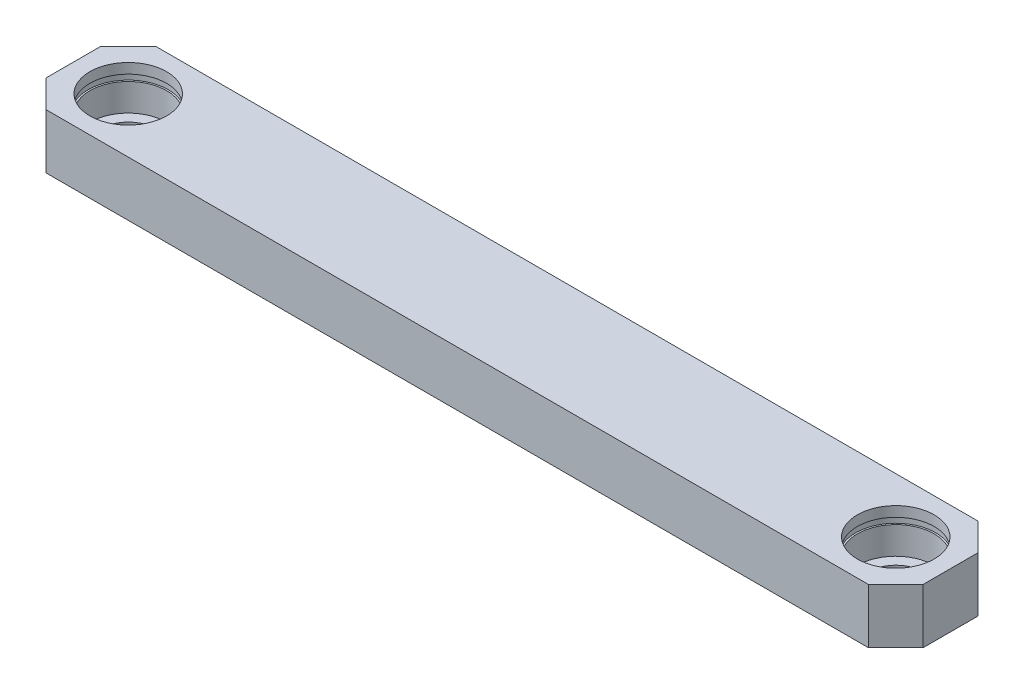
ISO-10303-21;
HEADER;
FILE_DESCRIPTION(('STEP AP214'),'2;1');
FILE_NAME('part.step','',(''),(''),'','','');
FILE_SCHEMA(('AUTOMOTIVE_DESIGN { 1 0 10303 214 1 1 1 1 }'));
ENDSEC;
DATA;
#1=APPLICATION_CONTEXT('core data for automotive mechanical design processes');
#2=APPLICATION_PROTOCOL_DEFINITION('international standard','automotive_design',2000,#1);
#3=PRODUCT_CONTEXT('',#1,'mechanical');
#4=PRODUCT('Part','Part','',(#3));
#5=PRODUCT_RELATED_PRODUCT_CATEGORY('part','',(#4));
#6=PRODUCT_DEFINITION_FORMATION('','',#4);
#7=PRODUCT_DEFINITION_CONTEXT('part definition',#1,'design');
#8=PRODUCT_DEFINITION('design','',#6,#7);
#9=PRODUCT_DEFINITION_SHAPE('','',#8);
#10=(LENGTH_UNIT() NAMED_UNIT(*) SI_UNIT(.MILLI.,.METRE.));
#11=(NAMED_UNIT(*) PLANE_ANGLE_UNIT() SI_UNIT($,.RADIAN.));
#12=(NAMED_UNIT(*) SI_UNIT($,.STERADIAN.) SOLID_ANGLE_UNIT());
#13=UNCERTAINTY_MEASURE_WITH_UNIT(LENGTH_MEASURE(1.E-05),#10,'distance_accuracy_value','');
#14=(GEOMETRIC_REPRESENTATION_CONTEXT(3) GLOBAL_UNCERTAINTY_ASSIGNED_CONTEXT((#13)) GLOBAL_UNIT_ASSIGNED_CONTEXT((#10,
#11,#12)) REPRESENTATION_CONTEXT('',''));
#15=CARTESIAN_POINT('',(0.,0.,0.));
#16=DIRECTION('',(0.,0.,1.));
#17=DIRECTION('',(1.,0.,0.));
#18=AXIS2_PLACEMENT_3D('',#15,#16,#17);
#19=CARTESIAN_POINT('',(0.,10.,-10.));
#20=DIRECTION('',(1.,0.,0.));
#21=DIRECTION('',(0.,0.,-1.));
#22=AXIS2_PLACEMENT_3D('',#19,#20,#21);
#23=PLANE('',#22);
#24=DIRECTION('',(0.,0.,1.));
#25=VECTOR('',#24,1.);
#26=CARTESIAN_POINT('',(0.,10.,-10.));
#27=LINE('',#26,#25);
#28=CARTESIAN_POINT('',(0.,10.,-4.99999999999998));
#29=VERTEX_POINT('',#28);
#30=CARTESIAN_POINT('',(0.,10.,4.99999999999997));
#31=VERTEX_POINT('',#30);
#32=EDGE_CURVE('E118',#29,#31,#27,.T.);
#33=ORIENTED_EDGE('',*,*,#32,.F.);
#34=DIRECTION('',(0.,-1.,0.));
#35=VECTOR('',#34,1.);
#36=CARTESIAN_POINT('',(0.,10.,-4.99999999999998));
#37=LINE('',#36,#35);
#38=CARTESIAN_POINT('',(0.,0.,-4.99999999999998));
#39=VERTEX_POINT('',#38);
#40=EDGE_CURVE('E103',#29,#39,#37,.T.);
#41=ORIENTED_EDGE('',*,*,#40,.T.);
#42=DIRECTION('',(0.,0.,1.));
#43=VECTOR('',#42,1.);
#44=CARTESIAN_POINT('',(0.,0.,-10.));
#45=LINE('',#44,#43);
#46=CARTESIAN_POINT('',(0.,0.,4.99999999999997));
#47=VERTEX_POINT('',#46);
#48=EDGE_CURVE('E115',#39,#47,#45,.T.);
#49=ORIENTED_EDGE('',*,*,#48,.T.);
#50=DIRECTION('',(0.,1.,0.));
#51=VECTOR('',#50,1.);
#52=CARTESIAN_POINT('',(0.,10.,4.99999999999997));
#53=LINE('',#52,#51);
#54=EDGE_CURVE('E120',#47,#31,#53,.T.);
#55=ORIENTED_EDGE('',*,*,#54,.T.);
#56=EDGE_LOOP('',(#33,#41,#49,#55));
#57=FACE_BOUND('',#56,.T.);
#58=ADVANCED_FACE('F33',(#57),#23,.F.);
#59=CARTESIAN_POINT('',(0.,10.,10.));
#60=DIRECTION('',(0.,0.,-1.));
#61=DIRECTION('',(-1.,0.,0.));
#62=AXIS2_PLACEMENT_3D('',#59,#60,#61);
#63=PLANE('',#62);
#64=DIRECTION('',(1.,0.,0.));
#65=VECTOR('',#64,1.);
#66=CARTESIAN_POINT('',(0.,0.,10.));
#67=LINE('',#66,#65);
#68=CARTESIAN_POINT('',(5.00000000000002,0.,10.));
#69=VERTEX_POINT('',#68);
#70=CARTESIAN_POINT('',(155.,0.,10.));
#71=VERTEX_POINT('',#70);
#72=EDGE_CURVE('E124',#69,#71,#67,.T.);
#73=ORIENTED_EDGE('',*,*,#72,.T.);
#74=DIRECTION('',(0.,1.,0.));
#75=VECTOR('',#74,1.);
#76=CARTESIAN_POINT('',(155.,10.,10.));
#77=LINE('',#76,#75);
#78=CARTESIAN_POINT('',(155.,10.,10.));
#79=VERTEX_POINT('',#78);
#80=EDGE_CURVE('E11',#71,#79,#77,.T.);
#81=ORIENTED_EDGE('',*,*,#80,.T.);
#82=DIRECTION('',(1.,0.,0.));
#83=VECTOR('',#82,1.);
#84=CARTESIAN_POINT('',(0.,10.,10.));
#85=LINE('',#84,#83);
#86=CARTESIAN_POINT('',(5.00000000000002,10.,10.));
#87=VERTEX_POINT('',#86);
#88=EDGE_CURVE('E164',#87,#79,#85,.T.);
#89=ORIENTED_EDGE('',*,*,#88,.F.);
#90=DIRECTION('',(0.,-1.,0.));
#91=VECTOR('',#90,1.);
#92=CARTESIAN_POINT('',(5.00000000000002,10.,10.));
#93=LINE('',#92,#91);
#94=EDGE_CURVE('E41',#87,#69,#93,.T.);
#95=ORIENTED_EDGE('',*,*,#94,.T.);
#96=EDGE_LOOP('',(#73,#81,#89,#95));
#97=FACE_BOUND('',#96,.T.);
#98=ADVANCED_FACE('F162',(#97),#63,.F.);
#99=CARTESIAN_POINT('',(160.,10.,-10.));
#100=DIRECTION('',(-1.,0.,0.));
#101=DIRECTION('',(0.,0.,1.));
#102=AXIS2_PLACEMENT_3D('',#99,#100,#101);
#103=PLANE('',#102);
#104=DIRECTION('',(0.,0.,-1.));
#105=VECTOR('',#104,1.);
#106=CARTESIAN_POINT('',(160.,0.,-10.));
#107=LINE('',#106,#105);
#108=CARTESIAN_POINT('',(160.,0.,4.99999999999998));
#109=VERTEX_POINT('',#108);
#110=CARTESIAN_POINT('',(160.,0.,-4.99999999999998));
#111=VERTEX_POINT('',#110);
#112=EDGE_CURVE('E128',#109,#111,#107,.T.);
#113=ORIENTED_EDGE('',*,*,#112,.T.);
#114=DIRECTION('',(0.,1.,0.));
#115=VECTOR('',#114,1.);
#116=CARTESIAN_POINT('',(160.,10.,-4.99999999999998));
#117=LINE('',#116,#115);
#118=CARTESIAN_POINT('',(160.,10.,-4.99999999999998));
#119=VERTEX_POINT('',#118);
#120=EDGE_CURVE('E48',#111,#119,#117,.T.);
#121=ORIENTED_EDGE('',*,*,#120,.T.);
#122=DIRECTION('',(0.,0.,-1.));
#123=VECTOR('',#122,1.);
#124=CARTESIAN_POINT('',(160.,10.,-10.));
#125=LINE('',#124,#123);
#126=CARTESIAN_POINT('',(160.,10.,4.99999999999998));
#127=VERTEX_POINT('',#126);
#128=EDGE_CURVE('E172',#127,#119,#125,.T.);
#129=ORIENTED_EDGE('',*,*,#128,.F.);
#130=DIRECTION('',(0.,-1.,0.));
#131=VECTOR('',#130,1.);
#132=CARTESIAN_POINT('',(160.,10.,4.99999999999998));
#133=LINE('',#132,#131);
#134=EDGE_CURVE('E155',#127,#109,#133,.T.);
#135=ORIENTED_EDGE('',*,*,#134,.T.);
#136=EDGE_LOOP('',(#113,#121,#129,#135));
#137=FACE_BOUND('',#136,.T.);
#138=ADVANCED_FACE('F171',(#137),#103,.F.);
#139=CARTESIAN_POINT('',(0.,10.,-10.));
#140=DIRECTION('',(0.,0.,1.));
#141=DIRECTION('',(1.,0.,0.));
#142=AXIS2_PLACEMENT_3D('',#139,#140,#141);
#143=PLANE('',#142);
#144=DIRECTION('',(-1.,0.,0.));
#145=VECTOR('',#144,1.);
#146=CARTESIAN_POINT('',(0.,0.,-10.));
#147=LINE('',#146,#145);
#148=CARTESIAN_POINT('',(155.,0.,-10.));
#149=VERTEX_POINT('',#148);
#150=CARTESIAN_POINT('',(5.00000000000004,0.,-10.));
#151=VERTEX_POINT('',#150);
#152=EDGE_CURVE('E138',#149,#151,#147,.T.);
#153=ORIENTED_EDGE('',*,*,#152,.T.);
#154=DIRECTION('',(0.,1.,0.));
#155=VECTOR('',#154,1.);
#156=CARTESIAN_POINT('',(5.00000000000004,10.,-10.));
#157=LINE('',#156,#155);
#158=CARTESIAN_POINT('',(5.00000000000004,10.,-10.));
#159=VERTEX_POINT('',#158);
#160=EDGE_CURVE('E104',#151,#159,#157,.T.);
#161=ORIENTED_EDGE('',*,*,#160,.T.);
#162=DIRECTION('',(-1.,0.,0.));
#163=VECTOR('',#162,1.);
#164=CARTESIAN_POINT('',(0.,10.,-10.));
#165=LINE('',#164,#163);
#166=CARTESIAN_POINT('',(155.,10.,-10.));
#167=VERTEX_POINT('',#166);
#168=EDGE_CURVE('E134',#167,#159,#165,.T.);
#169=ORIENTED_EDGE('',*,*,#168,.F.);
#170=DIRECTION('',(0.,-1.,0.));
#171=VECTOR('',#170,1.);
#172=CARTESIAN_POINT('',(155.,10.,-10.));
#173=LINE('',#172,#171);
#174=EDGE_CURVE('E109',#167,#149,#173,.T.);
#175=ORIENTED_EDGE('',*,*,#174,.T.);
#176=EDGE_LOOP('',(#153,#161,#169,#175));
#177=FACE_BOUND('',#176,.T.);
#178=ADVANCED_FACE('F228',(#177),#143,.F.);
#179=CARTESIAN_POINT('',(0.,10.,0.));
#180=DIRECTION('',(0.,1.,0.));
#181=DIRECTION('',(0.,0.,1.));
#182=AXIS2_PLACEMENT_3D('',#179,#180,#181);
#183=PLANE('',#182);
#184=CARTESIAN_POINT('',(150.,10.,0.));
#185=DIRECTION('',(0.,1.,0.));
#186=DIRECTION('',(0.,0.,1.));
#187=AXIS2_PLACEMENT_3D('',#184,#185,#186);
#188=CIRCLE('',#187,7.00000000000001);
#189=CARTESIAN_POINT('',(150.,10.,7.00000000000001));
#190=VERTEX_POINT('',#189);
#191=EDGE_CURVE('E219',#190,#190,#188,.T.);
#192=ORIENTED_EDGE('',*,*,#191,.F.);
#193=EDGE_LOOP('',(#192));
#194=FACE_BOUND('',#193,.T.);
#195=CARTESIAN_POINT('',(10.,10.,0.));
#196=DIRECTION('',(0.,1.,0.));
#197=DIRECTION('',(-1.,0.,0.));
#198=AXIS2_PLACEMENT_3D('',#195,#196,#197);
#199=CIRCLE('',#198,7.);
#200=CARTESIAN_POINT('',(3.,10.,0.));
#201=VERTEX_POINT('',#200);
#202=EDGE_CURVE('E192',#201,#201,#199,.T.);
#203=ORIENTED_EDGE('',*,*,#202,.F.);
#204=EDGE_LOOP('',(#203));
#205=FACE_BOUND('',#204,.T.);
#206=ORIENTED_EDGE('',*,*,#168,.T.);
#207=DIRECTION('',(0.707106781186549,0.,-0.707106781186547));
#208=VECTOR('',#207,1.);
#209=CARTESIAN_POINT('',(-2.49999999999999,10.,-2.5));
#210=LINE('',#209,#208);
#211=EDGE_CURVE('E153',#159,#29,#210,.F.);
#212=ORIENTED_EDGE('',*,*,#211,.T.);
#213=ORIENTED_EDGE('',*,*,#32,.T.);
#214=DIRECTION('',(-0.707106781186547,0.,-0.707106781186549));
#215=VECTOR('',#214,1.);
#216=CARTESIAN_POINT('',(-2.49999999999998,10.,2.49999999999998));
#217=LINE('',#216,#215);
#218=EDGE_CURVE('E148',#31,#87,#217,.F.);
#219=ORIENTED_EDGE('',*,*,#218,.T.);
#220=ORIENTED_EDGE('',*,*,#88,.T.);
#221=DIRECTION('',(-0.707106781186549,0.,0.707106781186547));
#222=VECTOR('',#221,1.);
#223=CARTESIAN_POINT('',(82.4999999999998,10.,82.5));
#224=LINE('',#223,#222);
#225=EDGE_CURVE('E55',#79,#127,#224,.F.);
#226=ORIENTED_EDGE('',*,*,#225,.T.);
#227=ORIENTED_EDGE('',*,*,#128,.T.);
#228=DIRECTION('',(0.707106781186547,0.,0.707106781186549));
#229=VECTOR('',#228,1.);
#230=CARTESIAN_POINT('',(82.5000000000002,10.,-82.5));
#231=LINE('',#230,#229);
#232=EDGE_CURVE('E151',#119,#167,#231,.F.);
#233=ORIENTED_EDGE('',*,*,#232,.T.);
#234=EDGE_LOOP('',(#206,#212,#213,#219,#220,#226,#227,#233));
#235=FACE_BOUND('',#234,.T.);
#236=ADVANCED_FACE('F225',(#194,#205,#235),#183,.T.);
#237=CARTESIAN_POINT('',(0.,0.,0.));
#238=DIRECTION('',(0.,1.,0.));
#239=DIRECTION('',(0.,0.,1.));
#240=AXIS2_PLACEMENT_3D('',#237,#238,#239);
#241=PLANE('',#240);
#242=CARTESIAN_POINT('',(150.,0.,0.));
#243=DIRECTION('',(0.,1.,0.));
#244=DIRECTION('',(0.,0.,1.));
#245=AXIS2_PLACEMENT_3D('',#242,#243,#244);
#246=CIRCLE('',#245,5.);
#247=CARTESIAN_POINT('',(150.,0.,5.));
#248=VERTEX_POINT('',#247);
#249=EDGE_CURVE('E198',#248,#248,#246,.T.);
#250=ORIENTED_EDGE('',*,*,#249,.T.);
#251=EDGE_LOOP('',(#250));
#252=FACE_BOUND('',#251,.T.);
#253=CARTESIAN_POINT('',(10.,0.,0.));
#254=DIRECTION('',(0.,1.,0.));
#255=DIRECTION('',(-1.,0.,0.));
#256=AXIS2_PLACEMENT_3D('',#253,#254,#255);
#257=CIRCLE('',#256,5.);
#258=CARTESIAN_POINT('',(5.,0.,0.));
#259=VERTEX_POINT('',#258);
#260=EDGE_CURVE('E189',#259,#259,#257,.T.);
#261=ORIENTED_EDGE('',*,*,#260,.T.);
#262=EDGE_LOOP('',(#261));
#263=FACE_BOUND('',#262,.T.);
#264=ORIENTED_EDGE('',*,*,#48,.F.);
#265=DIRECTION('',(-0.707106781186549,0.,0.707106781186547));
#266=VECTOR('',#265,1.);
#267=CARTESIAN_POINT('',(0.,0.,-4.99999999999998));
#268=LINE('',#267,#266);
#269=EDGE_CURVE('E99',#39,#151,#268,.F.);
#270=ORIENTED_EDGE('',*,*,#269,.T.);
#271=ORIENTED_EDGE('',*,*,#152,.F.);
#272=DIRECTION('',(-0.707106781186547,0.,-0.707106781186549));
#273=VECTOR('',#272,1.);
#274=CARTESIAN_POINT('',(155.,0.,-10.));
#275=LINE('',#274,#273);
#276=EDGE_CURVE('E110',#149,#111,#275,.F.);
#277=ORIENTED_EDGE('',*,*,#276,.T.);
#278=ORIENTED_EDGE('',*,*,#112,.F.);
#279=DIRECTION('',(0.707106781186549,0.,-0.707106781186547));
#280=VECTOR('',#279,1.);
#281=CARTESIAN_POINT('',(160.,0.,4.99999999999998));
#282=LINE('',#281,#280);
#283=EDGE_CURVE('E142',#109,#71,#282,.F.);
#284=ORIENTED_EDGE('',*,*,#283,.T.);
#285=ORIENTED_EDGE('',*,*,#72,.F.);
#286=DIRECTION('',(0.707106781186547,0.,0.707106781186549));
#287=VECTOR('',#286,1.);
#288=CARTESIAN_POINT('',(5.00000000000002,0.,10.));
#289=LINE('',#288,#287);
#290=EDGE_CURVE('E119',#69,#47,#289,.F.);
#291=ORIENTED_EDGE('',*,*,#290,.T.);
#292=EDGE_LOOP('',(#264,#270,#271,#277,#278,#284,#285,#291));
#293=FACE_BOUND('',#292,.T.);
#294=ADVANCED_FACE('F122',(#252,#263,#293),#241,.F.);
#295=CARTESIAN_POINT('',(0.,10.,-4.99999999999998));
#296=DIRECTION('',(0.707106781186546,0.,0.707106781186548));
#297=DIRECTION('',(0.,-1.,0.));
#298=AXIS2_PLACEMENT_3D('',#295,#296,#297);
#299=PLANE('',#298);
#300=ORIENTED_EDGE('',*,*,#211,.F.);
#301=ORIENTED_EDGE('',*,*,#160,.F.);
#302=ORIENTED_EDGE('',*,*,#269,.F.);
#303=ORIENTED_EDGE('',*,*,#40,.F.);
#304=EDGE_LOOP('',(#300,#301,#302,#303));
#305=FACE_BOUND('',#304,.T.);
#306=ADVANCED_FACE('F102',(#305),#299,.F.);
#307=CARTESIAN_POINT('',(155.,10.,-10.));
#308=DIRECTION('',(-0.707106781186549,0.,0.707106781186547));
#309=DIRECTION('',(0.,-1.,0.));
#310=AXIS2_PLACEMENT_3D('',#307,#308,#309);
#311=PLANE('',#310);
#312=ORIENTED_EDGE('',*,*,#232,.F.);
#313=ORIENTED_EDGE('',*,*,#120,.F.);
#314=ORIENTED_EDGE('',*,*,#276,.F.);
#315=ORIENTED_EDGE('',*,*,#174,.F.);
#316=EDGE_LOOP('',(#312,#313,#314,#315));
#317=FACE_BOUND('',#316,.T.);
#318=ADVANCED_FACE('F235',(#317),#311,.F.);
#319=CARTESIAN_POINT('',(160.,10.,4.99999999999998));
#320=DIRECTION('',(-0.707106781186546,0.,-0.707106781186548));
#321=DIRECTION('',(0.,-1.,0.));
#322=AXIS2_PLACEMENT_3D('',#319,#320,#321);
#323=PLANE('',#322);
#324=ORIENTED_EDGE('',*,*,#225,.F.);
#325=ORIENTED_EDGE('',*,*,#80,.F.);
#326=ORIENTED_EDGE('',*,*,#283,.F.);
#327=ORIENTED_EDGE('',*,*,#134,.F.);
#328=EDGE_LOOP('',(#324,#325,#326,#327));
#329=FACE_BOUND('',#328,.T.);
#330=ADVANCED_FACE('F170',(#329),#323,.F.);
#331=CARTESIAN_POINT('',(5.00000000000002,10.,10.));
#332=DIRECTION('',(0.707106781186548,0.,-0.707106781186546));
#333=DIRECTION('',(0.,-1.,0.));
#334=AXIS2_PLACEMENT_3D('',#331,#332,#333);
#335=PLANE('',#334);
#336=ORIENTED_EDGE('',*,*,#218,.F.);
#337=ORIENTED_EDGE('',*,*,#54,.F.);
#338=ORIENTED_EDGE('',*,*,#290,.F.);
#339=ORIENTED_EDGE('',*,*,#94,.F.);
#340=EDGE_LOOP('',(#336,#337,#338,#339));
#341=FACE_BOUND('',#340,.T.);
#342=ADVANCED_FACE('F35',(#341),#335,.F.);
#343=CARTESIAN_POINT('',(3.,8.15,0.));
#344=DIRECTION('',(0.,1.,0.));
#345=DIRECTION('',(-1.,0.,0.));
#346=AXIS2_PLACEMENT_3D('',#343,#344,#345);
#347=PLANE('',#346);
#348=CARTESIAN_POINT('',(10.,8.15,0.));
#349=DIRECTION('',(0.,1.,0.));
#350=DIRECTION('',(-1.,0.,0.));
#351=AXIS2_PLACEMENT_3D('',#348,#349,#350);
#352=CIRCLE('',#351,7.3);
#353=CARTESIAN_POINT('',(2.7,8.15,0.));
#354=VERTEX_POINT('',#353);
#355=EDGE_CURVE('E125',#354,#354,#352,.T.);
#356=ORIENTED_EDGE('',*,*,#355,.F.);
#357=EDGE_LOOP('',(#356));
#358=FACE_BOUND('',#357,.T.);
#359=CARTESIAN_POINT('',(10.,8.15,0.));
#360=DIRECTION('',(0.,1.,0.));
#361=DIRECTION('',(-1.,0.,0.));
#362=AXIS2_PLACEMENT_3D('',#359,#360,#361);
#363=CIRCLE('',#362,7.);
#364=CARTESIAN_POINT('',(3.,8.15,0.));
#365=VERTEX_POINT('',#364);
#366=EDGE_CURVE('E195',#365,#365,#363,.T.);
#367=ORIENTED_EDGE('',*,*,#366,.T.);
#368=EDGE_LOOP('',(#367));
#369=FACE_BOUND('',#368,.T.);
#370=ADVANCED_FACE('F257',(#358,#369),#347,.F.);
#371=CARTESIAN_POINT('',(10.,10.,0.));
#372=DIRECTION('',(0.,1.,0.));
#373=DIRECTION('',(-1.,0.,0.));
#374=AXIS2_PLACEMENT_3D('',#371,#372,#373);
#375=CYLINDRICAL_SURFACE('',#374,7.3);
#376=CARTESIAN_POINT('',(10.,7.,0.));
#377=DIRECTION('',(0.,1.,0.));
#378=DIRECTION('',(-1.,0.,0.));
#379=AXIS2_PLACEMENT_3D('',#376,#377,#378);
#380=CIRCLE('',#379,7.3);
#381=CARTESIAN_POINT('',(2.7,7.,0.));
#382=VERTEX_POINT('',#381);
#383=EDGE_CURVE('E131',#382,#382,#380,.T.);
#384=ORIENTED_EDGE('',*,*,#383,.F.);
#385=EDGE_LOOP('',(#384));
#386=FACE_BOUND('',#385,.T.);
#387=ORIENTED_EDGE('',*,*,#355,.T.);
#388=EDGE_LOOP('',(#387));
#389=FACE_BOUND('',#388,.T.);
#390=ADVANCED_FACE('F260',(#386,#389),#375,.F.);
#391=CARTESIAN_POINT('',(2.7,7.,0.));
#392=DIRECTION('',(0.,-1.,0.));
#393=DIRECTION('',(1.,0.,0.));
#394=AXIS2_PLACEMENT_3D('',#391,#392,#393);
#395=PLANE('',#394);
#396=CARTESIAN_POINT('',(10.,7.,0.));
#397=DIRECTION('',(0.,1.,0.));
#398=DIRECTION('',(-1.,0.,0.));
#399=AXIS2_PLACEMENT_3D('',#396,#397,#398);
#400=CIRCLE('',#399,7.);
#401=CARTESIAN_POINT('',(3.,7.,0.));
#402=VERTEX_POINT('',#401);
#403=EDGE_CURVE('E180',#402,#402,#400,.T.);
#404=ORIENTED_EDGE('',*,*,#403,.F.);
#405=EDGE_LOOP('',(#404));
#406=FACE_BOUND('',#405,.T.);
#407=ORIENTED_EDGE('',*,*,#383,.T.);
#408=EDGE_LOOP('',(#407));
#409=FACE_BOUND('',#408,.T.);
#410=ADVANCED_FACE('F264',(#406,#409),#395,.F.);
#411=CARTESIAN_POINT('',(10.,10.,0.));
#412=DIRECTION('',(0.,1.,0.));
#413=DIRECTION('',(-1.,0.,0.));
#414=AXIS2_PLACEMENT_3D('',#411,#412,#413);
#415=CYLINDRICAL_SURFACE('',#414,7.);
#416=CARTESIAN_POINT('',(10.,2.,0.));
#417=DIRECTION('',(0.,1.,0.));
#418=DIRECTION('',(-1.,0.,0.));
#419=AXIS2_PLACEMENT_3D('',#416,#417,#418);
#420=CIRCLE('',#419,7.);
#421=CARTESIAN_POINT('',(3.,2.,0.));
#422=VERTEX_POINT('',#421);
#423=EDGE_CURVE('E183',#422,#422,#420,.T.);
#424=ORIENTED_EDGE('',*,*,#423,.F.);
#425=EDGE_LOOP('',(#424));
#426=FACE_BOUND('',#425,.T.);
#427=ORIENTED_EDGE('',*,*,#403,.T.);
#428=EDGE_LOOP('',(#427));
#429=FACE_BOUND('',#428,.T.);
#430=ADVANCED_FACE('F268',(#426,#429),#415,.F.);
#431=CARTESIAN_POINT('',(3.,2.,0.));
#432=DIRECTION('',(0.,-1.,0.));
#433=DIRECTION('',(1.,0.,0.));
#434=AXIS2_PLACEMENT_3D('',#431,#432,#433);
#435=PLANE('',#434);
#436=CARTESIAN_POINT('',(10.,2.,0.));
#437=DIRECTION('',(0.,1.,0.));
#438=DIRECTION('',(-1.,0.,0.));
#439=AXIS2_PLACEMENT_3D('',#436,#437,#438);
#440=CIRCLE('',#439,5.);
#441=CARTESIAN_POINT('',(5.,2.,0.));
#442=VERTEX_POINT('',#441);
#443=EDGE_CURVE('E186',#442,#442,#440,.T.);
#444=ORIENTED_EDGE('',*,*,#443,.F.);
#445=EDGE_LOOP('',(#444));
#446=FACE_BOUND('',#445,.T.);
#447=ORIENTED_EDGE('',*,*,#423,.T.);
#448=EDGE_LOOP('',(#447));
#449=FACE_BOUND('',#448,.T.);
#450=ADVANCED_FACE('F272',(#446,#449),#435,.F.);
#451=CARTESIAN_POINT('',(10.,10.,0.));
#452=DIRECTION('',(0.,1.,0.));
#453=DIRECTION('',(-1.,0.,0.));
#454=AXIS2_PLACEMENT_3D('',#451,#452,#453);
#455=CYLINDRICAL_SURFACE('',#454,5.);
#456=ORIENTED_EDGE('',*,*,#260,.F.);
#457=EDGE_LOOP('',(#456));
#458=FACE_BOUND('',#457,.T.);
#459=ORIENTED_EDGE('',*,*,#443,.T.);
#460=EDGE_LOOP('',(#459));
#461=FACE_BOUND('',#460,.T.);
#462=ADVANCED_FACE('F276',(#458,#461),#455,.F.);
#463=CARTESIAN_POINT('',(10.,10.,0.));
#464=DIRECTION('',(0.,1.,0.));
#465=DIRECTION('',(-1.,0.,0.));
#466=AXIS2_PLACEMENT_3D('',#463,#464,#465);
#467=CYLINDRICAL_SURFACE('',#466,7.);
#468=ORIENTED_EDGE('',*,*,#366,.F.);
#469=EDGE_LOOP('',(#468));
#470=FACE_BOUND('',#469,.T.);
#471=ORIENTED_EDGE('',*,*,#202,.T.);
#472=EDGE_LOOP('',(#471));
#473=FACE_BOUND('',#472,.T.);
#474=ADVANCED_FACE('F280',(#470,#473),#467,.F.);
#475=CARTESIAN_POINT('',(150.,10.,0.));
#476=DIRECTION('',(0.,1.,0.));
#477=DIRECTION('',(0.,0.,1.));
#478=AXIS2_PLACEMENT_3D('',#475,#476,#477);
#479=CYLINDRICAL_SURFACE('',#478,5.);
#480=ORIENTED_EDGE('',*,*,#249,.F.);
#481=EDGE_LOOP('',(#480));
#482=FACE_BOUND('',#481,.T.);
#483=CARTESIAN_POINT('',(150.,2.,0.));
#484=DIRECTION('',(0.,1.,0.));
#485=DIRECTION('',(0.,0.,1.));
#486=AXIS2_PLACEMENT_3D('',#483,#484,#485);
#487=CIRCLE('',#486,5.);
#488=CARTESIAN_POINT('',(150.,2.,5.));
#489=VERTEX_POINT('',#488);
#490=EDGE_CURVE('E201',#489,#489,#487,.T.);
#491=ORIENTED_EDGE('',*,*,#490,.T.);
#492=EDGE_LOOP('',(#491));
#493=FACE_BOUND('',#492,.T.);
#494=ADVANCED_FACE('F284',(#482,#493),#479,.F.);
#495=CARTESIAN_POINT('',(143.,2.,0.));
#496=DIRECTION('',(0.,-1.,0.));
#497=DIRECTION('',(0.,0.,-1.));
#498=AXIS2_PLACEMENT_3D('',#495,#496,#497);
#499=PLANE('',#498);
#500=ORIENTED_EDGE('',*,*,#490,.F.);
#501=EDGE_LOOP('',(#500));
#502=FACE_BOUND('',#501,.T.);
#503=CARTESIAN_POINT('',(150.,2.,0.));
#504=DIRECTION('',(0.,1.,0.));
#505=DIRECTION('',(0.,0.,1.));
#506=AXIS2_PLACEMENT_3D('',#503,#504,#505);
#507=CIRCLE('',#506,7.00000000000001);
#508=CARTESIAN_POINT('',(150.,2.,7.00000000000001));
#509=VERTEX_POINT('',#508);
#510=EDGE_CURVE('E204',#509,#509,#507,.T.);
#511=ORIENTED_EDGE('',*,*,#510,.T.);
#512=EDGE_LOOP('',(#511));
#513=FACE_BOUND('',#512,.T.);
#514=ADVANCED_FACE('F288',(#502,#513),#499,.F.);
#515=CARTESIAN_POINT('',(150.,10.,0.));
#516=DIRECTION('',(0.,1.,0.));
#517=DIRECTION('',(0.,0.,1.));
#518=AXIS2_PLACEMENT_3D('',#515,#516,#517);
#519=CYLINDRICAL_SURFACE('',#518,7.00000000000001);
#520=ORIENTED_EDGE('',*,*,#510,.F.);
#521=EDGE_LOOP('',(#520));
#522=FACE_BOUND('',#521,.T.);
#523=CARTESIAN_POINT('',(150.,7.,0.));
#524=DIRECTION('',(0.,1.,0.));
#525=DIRECTION('',(0.,0.,1.));
#526=AXIS2_PLACEMENT_3D('',#523,#524,#525);
#527=CIRCLE('',#526,7.00000000000001);
#528=CARTESIAN_POINT('',(150.,7.,7.00000000000001));
#529=VERTEX_POINT('',#528);
#530=EDGE_CURVE('E207',#529,#529,#527,.T.);
#531=ORIENTED_EDGE('',*,*,#530,.T.);
#532=EDGE_LOOP('',(#531));
#533=FACE_BOUND('',#532,.T.);
#534=ADVANCED_FACE('F292',(#522,#533),#519,.F.);
#535=CARTESIAN_POINT('',(142.7,7.,0.));
#536=DIRECTION('',(0.,-1.,0.));
#537=DIRECTION('',(0.,0.,-1.));
#538=AXIS2_PLACEMENT_3D('',#535,#536,#537);
#539=PLANE('',#538);
#540=ORIENTED_EDGE('',*,*,#530,.F.);
#541=EDGE_LOOP('',(#540));
#542=FACE_BOUND('',#541,.T.);
#543=CARTESIAN_POINT('',(150.,7.,0.));
#544=DIRECTION('',(0.,1.,0.));
#545=DIRECTION('',(0.,0.,1.));
#546=AXIS2_PLACEMENT_3D('',#543,#544,#545);
#547=CIRCLE('',#546,7.3);
#548=CARTESIAN_POINT('',(150.,7.,7.3));
#549=VERTEX_POINT('',#548);
#550=EDGE_CURVE('E210',#549,#549,#547,.T.);
#551=ORIENTED_EDGE('',*,*,#550,.T.);
#552=EDGE_LOOP('',(#551));
#553=FACE_BOUND('',#552,.T.);
#554=ADVANCED_FACE('F296',(#542,#553),#539,.F.);
#555=CARTESIAN_POINT('',(150.,10.,0.));
#556=DIRECTION('',(0.,1.,0.));
#557=DIRECTION('',(0.,0.,1.));
#558=AXIS2_PLACEMENT_3D('',#555,#556,#557);
#559=CYLINDRICAL_SURFACE('',#558,7.3);
#560=ORIENTED_EDGE('',*,*,#550,.F.);
#561=EDGE_LOOP('',(#560));
#562=FACE_BOUND('',#561,.T.);
#563=CARTESIAN_POINT('',(150.,8.15,0.));
#564=DIRECTION('',(0.,1.,0.));
#565=DIRECTION('',(0.,0.,1.));
#566=AXIS2_PLACEMENT_3D('',#563,#564,#565);
#567=CIRCLE('',#566,7.3);
#568=CARTESIAN_POINT('',(150.,8.15,7.3));
#569=VERTEX_POINT('',#568);
#570=EDGE_CURVE('E213',#569,#569,#567,.T.);
#571=ORIENTED_EDGE('',*,*,#570,.T.);
#572=EDGE_LOOP('',(#571));
#573=FACE_BOUND('',#572,.T.);
#574=ADVANCED_FACE('F300',(#562,#573),#559,.F.);
#575=CARTESIAN_POINT('',(143.,8.15,0.));
#576=DIRECTION('',(0.,1.,0.));
#577=DIRECTION('',(0.,0.,1.));
#578=AXIS2_PLACEMENT_3D('',#575,#576,#577);
#579=PLANE('',#578);
#580=ORIENTED_EDGE('',*,*,#570,.F.);
#581=EDGE_LOOP('',(#580));
#582=FACE_BOUND('',#581,.T.);
#583=CARTESIAN_POINT('',(150.,8.15,0.));
#584=DIRECTION('',(0.,1.,0.));
#585=DIRECTION('',(0.,0.,1.));
#586=AXIS2_PLACEMENT_3D('',#583,#584,#585);
#587=CIRCLE('',#586,7.00000000000001);
#588=CARTESIAN_POINT('',(150.,8.15,7.00000000000001));
#589=VERTEX_POINT('',#588);
#590=EDGE_CURVE('E216',#589,#589,#587,.T.);
#591=ORIENTED_EDGE('',*,*,#590,.T.);
#592=EDGE_LOOP('',(#591));
#593=FACE_BOUND('',#592,.T.);
#594=ADVANCED_FACE('F304',(#582,#593),#579,.F.);
#595=CARTESIAN_POINT('',(150.,10.,0.));
#596=DIRECTION('',(0.,1.,0.));
#597=DIRECTION('',(0.,0.,1.));
#598=AXIS2_PLACEMENT_3D('',#595,#596,#597);
#599=CYLINDRICAL_SURFACE('',#598,7.00000000000001);
#600=ORIENTED_EDGE('',*,*,#590,.F.);
#601=EDGE_LOOP('',(#600));
#602=FACE_BOUND('',#601,.T.);
#603=ORIENTED_EDGE('',*,*,#191,.T.);
#604=EDGE_LOOP('',(#603));
#605=FACE_BOUND('',#604,.T.);
#606=ADVANCED_FACE('F223',(#602,#605),#599,.F.);
#607=CLOSED_SHELL('',(#58,#98,#138,#178,#236,#294,#306,#318,#330,#342,#370,#390,#410,#430,#450,
#462,#474,#494,#514,#534,#554,#574,#594,#606));
#608=MANIFOLD_SOLID_BREP('B2',#607);
#609=ADVANCED_BREP_SHAPE_REPRESENTATION('',(#18,#608),#14);
#610=SHAPE_DEFINITION_REPRESENTATION(#9,#609);
ENDSEC;
END-ISO-10303-21;
